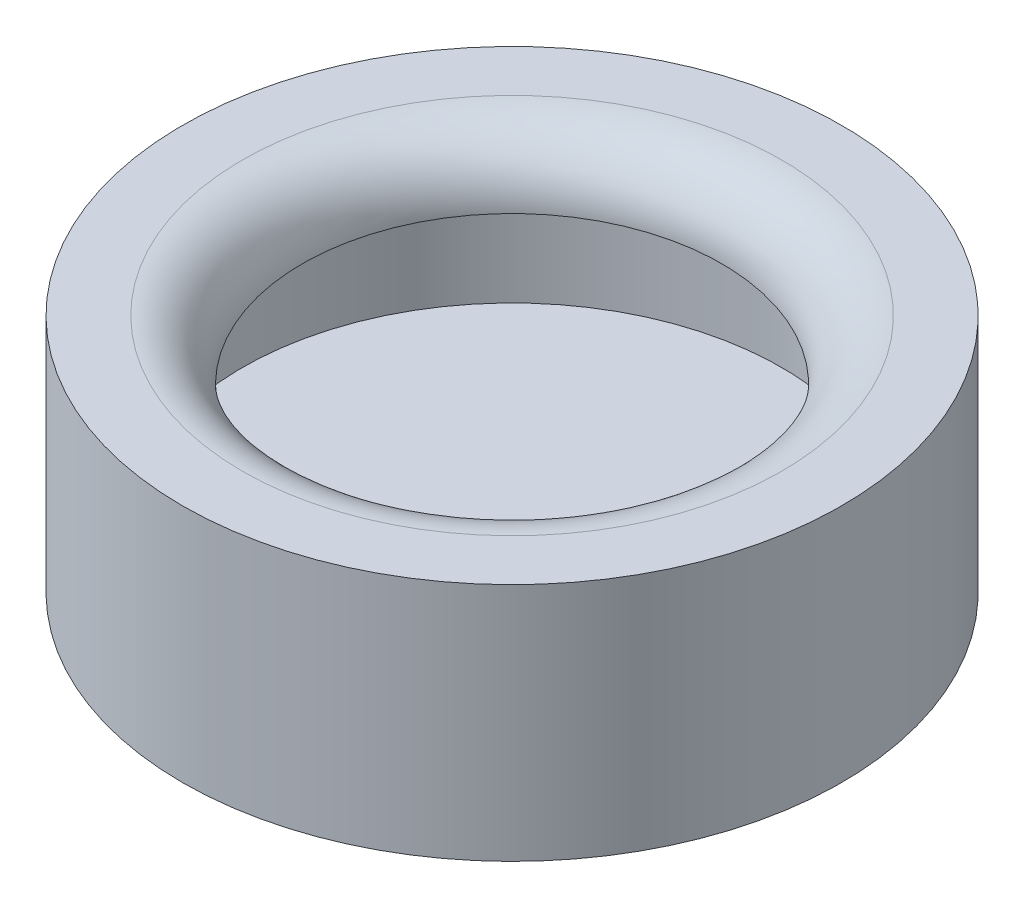
ISO-10303-21;
HEADER;
FILE_DESCRIPTION(('STEP AP214'),'2;1');
FILE_NAME('part.step','',(''),(''),'','','');
FILE_SCHEMA(('AUTOMOTIVE_DESIGN { 1 0 10303 214 1 1 1 1 }'));
ENDSEC;
DATA;
#1=APPLICATION_CONTEXT('core data for automotive mechanical design processes');
#2=APPLICATION_PROTOCOL_DEFINITION('international standard','automotive_design',2000,#1);
#3=PRODUCT_CONTEXT('',#1,'mechanical');
#4=PRODUCT('Part','Part','',(#3));
#5=PRODUCT_RELATED_PRODUCT_CATEGORY('part','',(#4));
#6=PRODUCT_DEFINITION_FORMATION('','',#4);
#7=PRODUCT_DEFINITION_CONTEXT('part definition',#1,'design');
#8=PRODUCT_DEFINITION('design','',#6,#7);
#9=PRODUCT_DEFINITION_SHAPE('','',#8);
#10=(LENGTH_UNIT() NAMED_UNIT(*) SI_UNIT(.MILLI.,.METRE.));
#11=(NAMED_UNIT(*) PLANE_ANGLE_UNIT() SI_UNIT($,.RADIAN.));
#12=(NAMED_UNIT(*) SI_UNIT($,.STERADIAN.) SOLID_ANGLE_UNIT());
#13=UNCERTAINTY_MEASURE_WITH_UNIT(LENGTH_MEASURE(1.E-05),#10,'distance_accuracy_value','');
#14=(GEOMETRIC_REPRESENTATION_CONTEXT(3) GLOBAL_UNCERTAINTY_ASSIGNED_CONTEXT((#13)) GLOBAL_UNIT_ASSIGNED_CONTEXT((#10,
#11,#12)) REPRESENTATION_CONTEXT('',''));
#15=CARTESIAN_POINT('',(0.,0.,0.));
#16=DIRECTION('',(0.,0.,1.));
#17=DIRECTION('',(1.,0.,0.));
#18=AXIS2_PLACEMENT_3D('',#15,#16,#17);
#19=CARTESIAN_POINT('',(0.,5.08,0.));
#20=DIRECTION('',(0.,-1.,0.));
#21=DIRECTION('',(0.,0.,-1.));
#22=AXIS2_PLACEMENT_3D('',#19,#20,#21);
#23=CYLINDRICAL_SURFACE('',#22,6.985);
#24=CARTESIAN_POINT('',(0.,5.08,0.));
#25=DIRECTION('',(0.,1.,0.));
#26=DIRECTION('',(0.,0.,1.));
#27=AXIS2_PLACEMENT_3D('',#24,#25,#26);
#28=CIRCLE('',#27,6.985);
#29=CARTESIAN_POINT('',(0.,5.08,6.985));
#30=VERTEX_POINT('',#29);
#31=EDGE_CURVE('E44',#30,#30,#28,.T.);
#32=ORIENTED_EDGE('',*,*,#31,.F.);
#33=EDGE_LOOP('',(#32));
#34=FACE_BOUND('',#33,.T.);
#35=CARTESIAN_POINT('',(0.,0.,0.));
#36=DIRECTION('',(0.,1.,0.));
#37=DIRECTION('',(0.,0.,1.));
#38=AXIS2_PLACEMENT_3D('',#35,#36,#37);
#39=CIRCLE('',#38,6.985);
#40=CARTESIAN_POINT('',(0.,0.,6.985));
#41=VERTEX_POINT('',#40);
#42=EDGE_CURVE('E48',#41,#41,#39,.T.);
#43=ORIENTED_EDGE('',*,*,#42,.T.);
#44=EDGE_LOOP('',(#43));
#45=FACE_BOUND('',#44,.T.);
#46=ADVANCED_FACE('F37',(#34,#45),#23,.T.);
#47=CARTESIAN_POINT('',(0.,5.08,0.));
#48=DIRECTION('',(0.,1.,0.));
#49=DIRECTION('',(0.,0.,1.));
#50=AXIS2_PLACEMENT_3D('',#47,#48,#49);
#51=PLANE('',#50);
#52=CARTESIAN_POINT('',(0.,5.08,0.));
#53=DIRECTION('',(0.,1.,0.));
#54=DIRECTION('',(0.,0.,1.));
#55=AXIS2_PLACEMENT_3D('',#52,#53,#54);
#56=CIRCLE('',#55,5.715);
#57=CARTESIAN_POINT('',(0.,5.08,5.715));
#58=VERTEX_POINT('',#57);
#59=EDGE_CURVE('E10',#58,#58,#56,.F.);
#60=ORIENTED_EDGE('',*,*,#59,.T.);
#61=EDGE_LOOP('',(#60));
#62=FACE_BOUND('',#61,.T.);
#63=ORIENTED_EDGE('',*,*,#31,.T.);
#64=EDGE_LOOP('',(#63));
#65=FACE_BOUND('',#64,.T.);
#66=ADVANCED_FACE('F77',(#62,#65),#51,.T.);
#67=CARTESIAN_POINT('',(0.,0.,0.));
#68=DIRECTION('',(0.,1.,0.));
#69=DIRECTION('',(0.,0.,1.));
#70=AXIS2_PLACEMENT_3D('',#67,#68,#69);
#71=PLANE('',#70);
#72=ORIENTED_EDGE('',*,*,#42,.F.);
#73=EDGE_LOOP('',(#72));
#74=FACE_BOUND('',#73,.T.);
#75=ADVANCED_FACE('F67',(#74),#71,.F.);
#76=CARTESIAN_POINT('',(0.,3.81,0.));
#77=DIRECTION('',(0.,1.,0.));
#78=DIRECTION('',(0.,0.,1.));
#79=AXIS2_PLACEMENT_3D('',#76,#77,#78);
#80=TOROIDAL_SURFACE('',#79,5.715,1.27);
#81=ORIENTED_EDGE('',*,*,#59,.F.);
#82=EDGE_LOOP('',(#81));
#83=FACE_BOUND('',#82,.T.);
#84=CARTESIAN_POINT('',(0.,3.81,0.));
#85=DIRECTION('',(0.,1.,0.));
#86=DIRECTION('',(0.,0.,1.));
#87=AXIS2_PLACEMENT_3D('',#84,#85,#86);
#88=CIRCLE('',#87,4.445);
#89=CARTESIAN_POINT('',(0.,3.81,4.445));
#90=VERTEX_POINT('',#89);
#91=EDGE_CURVE('E58',#90,#90,#88,.T.);
#92=ORIENTED_EDGE('',*,*,#91,.F.);
#93=EDGE_LOOP('',(#92));
#94=FACE_BOUND('',#93,.T.);
#95=ADVANCED_FACE('F39',(#83,#94),#80,.T.);
#96=CARTESIAN_POINT('',(0.,3.81,0.));
#97=DIRECTION('',(0.,1.,0.));
#98=DIRECTION('',(0.,0.,1.));
#99=AXIS2_PLACEMENT_3D('',#96,#97,#98);
#100=PLANE('',#99);
#101=CARTESIAN_POINT('',(0.,3.81,0.));
#102=DIRECTION('',(0.,1.,0.));
#103=DIRECTION('',(0.,0.,1.));
#104=AXIS2_PLACEMENT_3D('',#101,#102,#103);
#105=CIRCLE('',#104,5.715);
#106=CARTESIAN_POINT('',(0.,3.81,5.715));
#107=VERTEX_POINT('',#106);
#108=EDGE_CURVE('E53',#107,#107,#105,.T.);
#109=ORIENTED_EDGE('',*,*,#108,.F.);
#110=EDGE_LOOP('',(#109));
#111=FACE_BOUND('',#110,.T.);
#112=ORIENTED_EDGE('',*,*,#91,.T.);
#113=EDGE_LOOP('',(#112));
#114=FACE_BOUND('',#113,.T.);
#115=ADVANCED_FACE('F64',(#111,#114),#100,.F.);
#116=CARTESIAN_POINT('',(0.,3.81,0.));
#117=DIRECTION('',(0.,-1.,0.));
#118=DIRECTION('',(0.,0.,-1.));
#119=AXIS2_PLACEMENT_3D('',#116,#117,#118);
#120=CYLINDRICAL_SURFACE('',#119,5.715);
#121=ORIENTED_EDGE('',*,*,#108,.T.);
#122=EDGE_LOOP('',(#121));
#123=FACE_BOUND('',#122,.T.);
#124=CARTESIAN_POINT('',(0.,1.27,0.));
#125=DIRECTION('',(0.,1.,0.));
#126=DIRECTION('',(0.,0.,1.));
#127=AXIS2_PLACEMENT_3D('',#124,#125,#126);
#128=CIRCLE('',#127,5.715);
#129=CARTESIAN_POINT('',(0.,1.27,5.715));
#130=VERTEX_POINT('',#129);
#131=EDGE_CURVE('E55',#130,#130,#128,.T.);
#132=ORIENTED_EDGE('',*,*,#131,.F.);
#133=EDGE_LOOP('',(#132));
#134=FACE_BOUND('',#133,.T.);
#135=ADVANCED_FACE('F73',(#123,#134),#120,.F.);
#136=CARTESIAN_POINT('',(0.,1.27,0.));
#137=DIRECTION('',(0.,1.,0.));
#138=DIRECTION('',(0.,0.,1.));
#139=AXIS2_PLACEMENT_3D('',#136,#137,#138);
#140=PLANE('',#139);
#141=ORIENTED_EDGE('',*,*,#131,.T.);
#142=EDGE_LOOP('',(#141));
#143=FACE_BOUND('',#142,.T.);
#144=ADVANCED_FACE('F87',(#143),#140,.T.);
#145=CLOSED_SHELL('',(#46,#66,#75,#95,#115,#135,#144));
#146=MANIFOLD_SOLID_BREP('B2',#145);
#147=ADVANCED_BREP_SHAPE_REPRESENTATION('',(#18,#146),#14);
#148=SHAPE_DEFINITION_REPRESENTATION(#9,#147);
ENDSEC;
END-ISO-10303-21;
